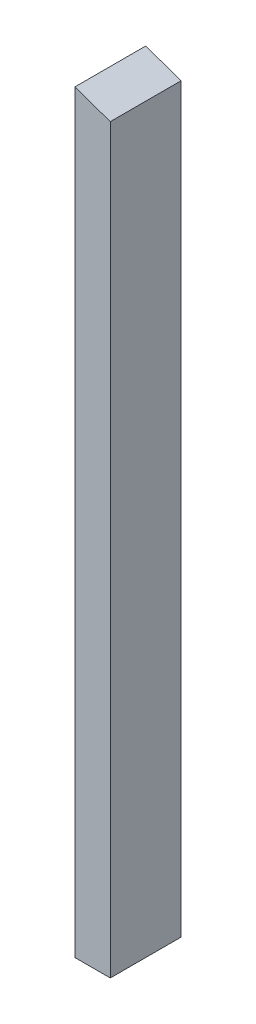
ISO-10303-21;
HEADER;
FILE_DESCRIPTION(('STEP AP214'),'2;1');
FILE_NAME('part.step','',(''),(''),'','','');
FILE_SCHEMA(('AUTOMOTIVE_DESIGN { 1 0 10303 214 1 1 1 1 }'));
ENDSEC;
DATA;
#1=APPLICATION_CONTEXT('core data for automotive mechanical design processes');
#2=APPLICATION_PROTOCOL_DEFINITION('international standard','automotive_design',2000,#1);
#3=PRODUCT_CONTEXT('',#1,'mechanical');
#4=PRODUCT('Part','Part','',(#3));
#5=PRODUCT_RELATED_PRODUCT_CATEGORY('part','',(#4));
#6=PRODUCT_DEFINITION_FORMATION('','',#4);
#7=PRODUCT_DEFINITION_CONTEXT('part definition',#1,'design');
#8=PRODUCT_DEFINITION('design','',#6,#7);
#9=PRODUCT_DEFINITION_SHAPE('','',#8);
#10=(LENGTH_UNIT() NAMED_UNIT(*) SI_UNIT(.MILLI.,.METRE.));
#11=(NAMED_UNIT(*) PLANE_ANGLE_UNIT() SI_UNIT($,.RADIAN.));
#12=(NAMED_UNIT(*) SI_UNIT($,.STERADIAN.) SOLID_ANGLE_UNIT());
#13=UNCERTAINTY_MEASURE_WITH_UNIT(LENGTH_MEASURE(1.E-05),#10,'distance_accuracy_value','');
#14=(GEOMETRIC_REPRESENTATION_CONTEXT(3) GLOBAL_UNCERTAINTY_ASSIGNED_CONTEXT((#13)) GLOBAL_UNIT_ASSIGNED_CONTEXT((#10,
#11,#12)) REPRESENTATION_CONTEXT('',''));
#15=CARTESIAN_POINT('',(0.,0.,0.));
#16=DIRECTION('',(0.,0.,1.));
#17=DIRECTION('',(1.,0.,0.));
#18=AXIS2_PLACEMENT_3D('',#15,#16,#17);
#19=CARTESIAN_POINT('',(-12.5,550.,-25.));
#20=DIRECTION('',(1.,0.,0.));
#21=DIRECTION('',(0.,0.,-1.));
#22=AXIS2_PLACEMENT_3D('',#19,#20,#21);
#23=PLANE('',#22);
#24=DIRECTION('',(0.,-1.,0.));
#25=VECTOR('',#24,1.);
#26=CARTESIAN_POINT('',(-12.5,550.,25.));
#27=LINE('',#26,#25);
#28=CARTESIAN_POINT('',(-12.5,532.24968156,25.));
#29=VERTEX_POINT('',#28);
#30=CARTESIAN_POINT('',(-12.5,0.,25.));
#31=VERTEX_POINT('',#30);
#32=EDGE_CURVE('E50',#29,#31,#27,.T.);
#33=ORIENTED_EDGE('',*,*,#32,.F.);
#34=DIRECTION('',(0.,0.,1.));
#35=VECTOR('',#34,1.);
#36=CARTESIAN_POINT('',(-12.5,532.24968156,-525.));
#37=LINE('',#36,#35);
#38=CARTESIAN_POINT('',(-12.5,532.24968156,-25.));
#39=VERTEX_POINT('',#38);
#40=EDGE_CURVE('E81',#39,#29,#37,.T.);
#41=ORIENTED_EDGE('',*,*,#40,.F.);
#42=DIRECTION('',(0.,-1.,0.));
#43=VECTOR('',#42,1.);
#44=CARTESIAN_POINT('',(-12.5,550.,-25.));
#45=LINE('',#44,#43);
#46=CARTESIAN_POINT('',(-12.5,0.,-25.));
#47=VERTEX_POINT('',#46);
#48=EDGE_CURVE('E64',#39,#47,#45,.T.);
#49=ORIENTED_EDGE('',*,*,#48,.T.);
#50=DIRECTION('',(0.,0.,1.));
#51=VECTOR('',#50,1.);
#52=CARTESIAN_POINT('',(-12.5,0.,-25.));
#53=LINE('',#52,#51);
#54=EDGE_CURVE('E97',#47,#31,#53,.T.);
#55=ORIENTED_EDGE('',*,*,#54,.T.);
#56=EDGE_LOOP('',(#33,#41,#49,#55));
#57=FACE_BOUND('',#56,.T.);
#58=ADVANCED_FACE('F42',(#57),#23,.F.);
#59=CARTESIAN_POINT('',(12.5,550.,25.));
#60=DIRECTION('',(0.,0.,-1.));
#61=DIRECTION('',(-1.,0.,0.));
#62=AXIS2_PLACEMENT_3D('',#59,#60,#61);
#63=PLANE('',#62);
#64=DIRECTION('',(0.,-1.,0.));
#65=VECTOR('',#64,1.);
#66=CARTESIAN_POINT('',(12.5,550.,25.));
#67=LINE('',#66,#65);
#68=CARTESIAN_POINT('',(12.5,523.51952282,25.));
#69=VERTEX_POINT('',#68);
#70=CARTESIAN_POINT('',(12.5,0.,25.));
#71=VERTEX_POINT('',#70);
#72=EDGE_CURVE('E93',#69,#71,#67,.T.);
#73=ORIENTED_EDGE('',*,*,#72,.F.);
#74=DIRECTION('',(0.944091748462167,-0.329682833167953,0.));
#75=VECTOR('',#74,1.);
#76=CARTESIAN_POINT('',(12.5,523.51952282,25.));
#77=LINE('',#76,#75);
#78=EDGE_CURVE('E84',#29,#69,#77,.T.);
#79=ORIENTED_EDGE('',*,*,#78,.F.);
#80=ORIENTED_EDGE('',*,*,#32,.T.);
#81=DIRECTION('',(1.,0.,0.));
#82=VECTOR('',#81,1.);
#83=CARTESIAN_POINT('',(12.5,0.,25.));
#84=LINE('',#83,#82);
#85=EDGE_CURVE('E114',#31,#71,#84,.T.);
#86=ORIENTED_EDGE('',*,*,#85,.T.);
#87=EDGE_LOOP('',(#73,#79,#80,#86));
#88=FACE_BOUND('',#87,.T.);
#89=ADVANCED_FACE('F90',(#88),#63,.F.);
#90=CARTESIAN_POINT('',(12.5,550.,-25.));
#91=DIRECTION('',(-1.,0.,0.));
#92=DIRECTION('',(0.,0.,1.));
#93=AXIS2_PLACEMENT_3D('',#90,#91,#92);
#94=PLANE('',#93);
#95=DIRECTION('',(0.,-1.,0.));
#96=VECTOR('',#95,1.);
#97=CARTESIAN_POINT('',(12.5,550.,-25.));
#98=LINE('',#97,#96);
#99=CARTESIAN_POINT('',(12.5,523.51952282,-25.));
#100=VERTEX_POINT('',#99);
#101=CARTESIAN_POINT('',(12.5,0.,-25.));
#102=VERTEX_POINT('',#101);
#103=EDGE_CURVE('E100',#100,#102,#98,.T.);
#104=ORIENTED_EDGE('',*,*,#103,.F.);
#105=DIRECTION('',(0.,0.,1.));
#106=VECTOR('',#105,1.);
#107=CARTESIAN_POINT('',(12.5,523.51952282,-525.));
#108=LINE('',#107,#106);
#109=EDGE_CURVE('E57',#100,#69,#108,.T.);
#110=ORIENTED_EDGE('',*,*,#109,.T.);
#111=ORIENTED_EDGE('',*,*,#72,.T.);
#112=DIRECTION('',(0.,0.,-1.));
#113=VECTOR('',#112,1.);
#114=CARTESIAN_POINT('',(12.5,0.,-25.));
#115=LINE('',#114,#113);
#116=EDGE_CURVE('E110',#71,#102,#115,.T.);
#117=ORIENTED_EDGE('',*,*,#116,.T.);
#118=EDGE_LOOP('',(#104,#110,#111,#117));
#119=FACE_BOUND('',#118,.T.);
#120=ADVANCED_FACE('F130',(#119),#94,.F.);
#121=CARTESIAN_POINT('',(12.5,550.,-25.));
#122=DIRECTION('',(0.,0.,1.));
#123=DIRECTION('',(1.,0.,0.));
#124=AXIS2_PLACEMENT_3D('',#121,#122,#123);
#125=PLANE('',#124);
#126=ORIENTED_EDGE('',*,*,#48,.F.);
#127=DIRECTION('',(0.944091748462167,-0.329682833167953,0.));
#128=VECTOR('',#127,1.);
#129=CARTESIAN_POINT('',(4.25792917047851,526.397706287522,-25.));
#130=LINE('',#129,#128);
#131=EDGE_CURVE('E11',#39,#100,#130,.T.);
#132=ORIENTED_EDGE('',*,*,#131,.T.);
#133=ORIENTED_EDGE('',*,*,#103,.T.);
#134=DIRECTION('',(-1.,0.,0.));
#135=VECTOR('',#134,1.);
#136=CARTESIAN_POINT('',(12.5,0.,-25.));
#137=LINE('',#136,#135);
#138=EDGE_CURVE('E107',#102,#47,#137,.T.);
#139=ORIENTED_EDGE('',*,*,#138,.T.);
#140=EDGE_LOOP('',(#126,#132,#133,#139));
#141=FACE_BOUND('',#140,.T.);
#142=ADVANCED_FACE('F134',(#141),#125,.F.);
#143=CARTESIAN_POINT('',(0.,0.,0.));
#144=DIRECTION('',(0.,-1.,0.));
#145=DIRECTION('',(0.,0.,-1.));
#146=AXIS2_PLACEMENT_3D('',#143,#144,#145);
#147=PLANE('',#146);
#148=CARTESIAN_POINT('',(0.,0.,0.));
#149=DIRECTION('',(0.,-1.,0.));
#150=DIRECTION('',(0.,0.,-1.));
#151=AXIS2_PLACEMENT_3D('',#148,#149,#150);
#152=CIRCLE('',#151,4.);
#153=CARTESIAN_POINT('',(0.,0.,-4.));
#154=VERTEX_POINT('',#153);
#155=EDGE_CURVE('E120',#154,#154,#152,.T.);
#156=ORIENTED_EDGE('',*,*,#155,.F.);
#157=EDGE_LOOP('',(#156));
#158=FACE_BOUND('',#157,.T.);
#159=ORIENTED_EDGE('',*,*,#54,.F.);
#160=ORIENTED_EDGE('',*,*,#138,.F.);
#161=ORIENTED_EDGE('',*,*,#116,.F.);
#162=ORIENTED_EDGE('',*,*,#85,.F.);
#163=EDGE_LOOP('',(#159,#160,#161,#162));
#164=FACE_BOUND('',#163,.T.);
#165=ADVANCED_FACE('F136',(#158,#164),#147,.T.);
#166=CARTESIAN_POINT('',(0.,10.,0.));
#167=DIRECTION('',(0.,-1.,0.));
#168=DIRECTION('',(0.,0.,-1.));
#169=AXIS2_PLACEMENT_3D('',#166,#167,#168);
#170=CYLINDRICAL_SURFACE('',#169,4.);
#171=CARTESIAN_POINT('',(0.,10.,0.));
#172=DIRECTION('',(0.,-1.,0.));
#173=DIRECTION('',(0.,0.,-1.));
#174=AXIS2_PLACEMENT_3D('',#171,#172,#173);
#175=CIRCLE('',#174,4.);
#176=CARTESIAN_POINT('',(0.,10.,-4.));
#177=VERTEX_POINT('',#176);
#178=EDGE_CURVE('E119',#177,#177,#175,.T.);
#179=ORIENTED_EDGE('',*,*,#178,.F.);
#180=EDGE_LOOP('',(#179));
#181=FACE_BOUND('',#180,.T.);
#182=ORIENTED_EDGE('',*,*,#155,.T.);
#183=EDGE_LOOP('',(#182));
#184=FACE_BOUND('',#183,.T.);
#185=ADVANCED_FACE('F138',(#181,#184),#170,.F.);
#186=CARTESIAN_POINT('',(0.,10.,0.));
#187=DIRECTION('',(0.,-1.,0.));
#188=DIRECTION('',(0.,0.,-1.));
#189=AXIS2_PLACEMENT_3D('',#186,#187,#188);
#190=PLANE('',#189);
#191=ORIENTED_EDGE('',*,*,#178,.T.);
#192=EDGE_LOOP('',(#191));
#193=FACE_BOUND('',#192,.T.);
#194=ADVANCED_FACE('F145',(#193),#190,.T.);
#195=CARTESIAN_POINT('',(12.5,523.51952282,-525.));
#196=DIRECTION('',(-0.329682833167952,-0.944091748462167,0.));
#197=DIRECTION('',(0.944091748462167,-0.329682833167953,0.));
#198=AXIS2_PLACEMENT_3D('',#195,#196,#197);
#199=PLANE('',#198);
#200=ORIENTED_EDGE('',*,*,#40,.T.);
#201=ORIENTED_EDGE('',*,*,#78,.T.);
#202=ORIENTED_EDGE('',*,*,#109,.F.);
#203=ORIENTED_EDGE('',*,*,#131,.F.);
#204=EDGE_LOOP('',(#200,#201,#202,#203));
#205=FACE_BOUND('',#204,.T.);
#206=ADVANCED_FACE('F83',(#205),#199,.F.);
#207=CLOSED_SHELL('',(#58,#89,#120,#142,#165,#185,#194,#206));
#208=MANIFOLD_SOLID_BREP('B2',#207);
#209=ADVANCED_BREP_SHAPE_REPRESENTATION('',(#18,#208),#14);
#210=SHAPE_DEFINITION_REPRESENTATION(#9,#209);
ENDSEC;
END-ISO-10303-21;
